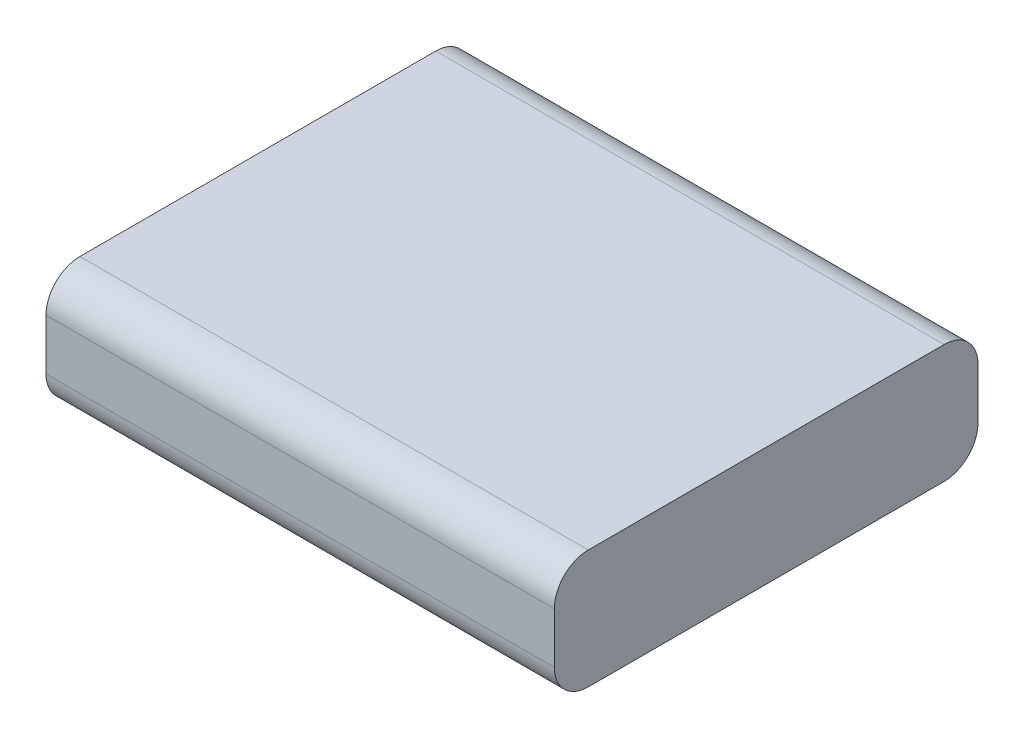
ISO-10303-21;
HEADER;
FILE_DESCRIPTION(('STEP AP214'),'2;1');
FILE_NAME('part.step','',(''),(''),'','','');
FILE_SCHEMA(('AUTOMOTIVE_DESIGN { 1 0 10303 214 1 1 1 1 }'));
ENDSEC;
DATA;
#1=APPLICATION_CONTEXT('core data for automotive mechanical design processes');
#2=APPLICATION_PROTOCOL_DEFINITION('international standard','automotive_design',2000,#1);
#3=PRODUCT_CONTEXT('',#1,'mechanical');
#4=PRODUCT('Part','Part','',(#3));
#5=PRODUCT_RELATED_PRODUCT_CATEGORY('part','',(#4));
#6=PRODUCT_DEFINITION_FORMATION('','',#4);
#7=PRODUCT_DEFINITION_CONTEXT('part definition',#1,'design');
#8=PRODUCT_DEFINITION('design','',#6,#7);
#9=PRODUCT_DEFINITION_SHAPE('','',#8);
#10=(LENGTH_UNIT() NAMED_UNIT(*) SI_UNIT(.MILLI.,.METRE.));
#11=(NAMED_UNIT(*) PLANE_ANGLE_UNIT() SI_UNIT($,.RADIAN.));
#12=(NAMED_UNIT(*) SI_UNIT($,.STERADIAN.) SOLID_ANGLE_UNIT());
#13=UNCERTAINTY_MEASURE_WITH_UNIT(LENGTH_MEASURE(1.E-05),#10,'distance_accuracy_value','');
#14=(GEOMETRIC_REPRESENTATION_CONTEXT(3) GLOBAL_UNCERTAINTY_ASSIGNED_CONTEXT((#13)) GLOBAL_UNIT_ASSIGNED_CONTEXT((#10,
#11,#12)) REPRESENTATION_CONTEXT('',''));
#15=CARTESIAN_POINT('',(0.,0.,0.));
#16=DIRECTION('',(0.,0.,1.));
#17=DIRECTION('',(1.,0.,0.));
#18=AXIS2_PLACEMENT_3D('',#15,#16,#17);
#19=CARTESIAN_POINT('',(15.,7.,-12.5));
#20=DIRECTION('',(-1.,0.,0.));
#21=DIRECTION('',(0.,0.,1.));
#22=AXIS2_PLACEMENT_3D('',#19,#20,#21);
#23=PLANE('',#22);
#24=DIRECTION('',(0.,0.,-1.));
#25=VECTOR('',#24,1.);
#26=CARTESIAN_POINT('',(15.,0.,-12.5));
#27=LINE('',#26,#25);
#28=CARTESIAN_POINT('',(15.,0.,10.5));
#29=VERTEX_POINT('',#28);
#30=CARTESIAN_POINT('',(15.,0.,-10.5));
#31=VERTEX_POINT('',#30);
#32=EDGE_CURVE('E160',#29,#31,#27,.T.);
#33=ORIENTED_EDGE('',*,*,#32,.T.);
#34=CARTESIAN_POINT('',(15.,2.,-10.5));
#35=DIRECTION('',(-1.,0.,0.));
#36=DIRECTION('',(0.,0.,1.));
#37=AXIS2_PLACEMENT_3D('',#34,#35,#36);
#38=CIRCLE('',#37,2.);
#39=CARTESIAN_POINT('',(15.,2.,-12.5));
#40=VERTEX_POINT('',#39);
#41=EDGE_CURVE('E141',#31,#40,#38,.F.);
#42=ORIENTED_EDGE('',*,*,#41,.T.);
#43=DIRECTION('',(0.,-1.,0.));
#44=VECTOR('',#43,1.);
#45=CARTESIAN_POINT('',(15.,7.,-12.5));
#46=LINE('',#45,#44);
#47=CARTESIAN_POINT('',(15.,5.,-12.5));
#48=VERTEX_POINT('',#47);
#49=EDGE_CURVE('E120',#48,#40,#46,.T.);
#50=ORIENTED_EDGE('',*,*,#49,.F.);
#51=CARTESIAN_POINT('',(15.,5.,-10.5));
#52=DIRECTION('',(-1.,0.,0.));
#53=DIRECTION('',(0.,0.,1.));
#54=AXIS2_PLACEMENT_3D('',#51,#52,#53);
#55=CIRCLE('',#54,2.);
#56=CARTESIAN_POINT('',(15.,7.,-10.5));
#57=VERTEX_POINT('',#56);
#58=EDGE_CURVE('E125',#48,#57,#55,.F.);
#59=ORIENTED_EDGE('',*,*,#58,.T.);
#60=DIRECTION('',(0.,0.,-1.));
#61=VECTOR('',#60,1.);
#62=CARTESIAN_POINT('',(15.,7.,-12.5));
#63=LINE('',#62,#61);
#64=CARTESIAN_POINT('',(15.,7.,10.5));
#65=VERTEX_POINT('',#64);
#66=EDGE_CURVE('E151',#65,#57,#63,.T.);
#67=ORIENTED_EDGE('',*,*,#66,.F.);
#68=CARTESIAN_POINT('',(15.,5.,10.5));
#69=DIRECTION('',(-1.,0.,0.));
#70=DIRECTION('',(0.,0.,1.));
#71=AXIS2_PLACEMENT_3D('',#68,#69,#70);
#72=CIRCLE('',#71,2.);
#73=CARTESIAN_POINT('',(15.,5.,12.5));
#74=VERTEX_POINT('',#73);
#75=EDGE_CURVE('E56',#65,#74,#72,.F.);
#76=ORIENTED_EDGE('',*,*,#75,.T.);
#77=DIRECTION('',(0.,-1.,0.));
#78=VECTOR('',#77,1.);
#79=CARTESIAN_POINT('',(15.,7.,12.5));
#80=LINE('',#79,#78);
#81=CARTESIAN_POINT('',(15.,2.,12.5));
#82=VERTEX_POINT('',#81);
#83=EDGE_CURVE('E157',#74,#82,#80,.T.);
#84=ORIENTED_EDGE('',*,*,#83,.T.);
#85=CARTESIAN_POINT('',(15.,2.,10.5));
#86=DIRECTION('',(-1.,0.,0.));
#87=DIRECTION('',(0.,0.,1.));
#88=AXIS2_PLACEMENT_3D('',#85,#86,#87);
#89=CIRCLE('',#88,2.);
#90=EDGE_CURVE('E48',#82,#29,#89,.F.);
#91=ORIENTED_EDGE('',*,*,#90,.T.);
#92=EDGE_LOOP('',(#33,#42,#50,#59,#67,#76,#84,#91));
#93=FACE_BOUND('',#92,.T.);
#94=ADVANCED_FACE('F33',(#93),#23,.F.);
#95=CARTESIAN_POINT('',(-15.,7.,-12.5));
#96=DIRECTION('',(0.,0.,1.));
#97=DIRECTION('',(1.,0.,0.));
#98=AXIS2_PLACEMENT_3D('',#95,#96,#97);
#99=PLANE('',#98);
#100=ORIENTED_EDGE('',*,*,#49,.T.);
#101=DIRECTION('',(-1.,0.,0.));
#102=VECTOR('',#101,1.);
#103=CARTESIAN_POINT('',(-15.,2.,-12.5));
#104=LINE('',#103,#102);
#105=CARTESIAN_POINT('',(-15.,2.,-12.5));
#106=VERTEX_POINT('',#105);
#107=EDGE_CURVE('E119',#40,#106,#104,.T.);
#108=ORIENTED_EDGE('',*,*,#107,.T.);
#109=DIRECTION('',(0.,-1.,0.));
#110=VECTOR('',#109,1.);
#111=CARTESIAN_POINT('',(-15.,7.,-12.5));
#112=LINE('',#111,#110);
#113=CARTESIAN_POINT('',(-15.,5.,-12.5));
#114=VERTEX_POINT('',#113);
#115=EDGE_CURVE('E103',#114,#106,#112,.T.);
#116=ORIENTED_EDGE('',*,*,#115,.F.);
#117=DIRECTION('',(-1.,0.,0.));
#118=VECTOR('',#117,1.);
#119=CARTESIAN_POINT('',(15.,5.,-12.5));
#120=LINE('',#119,#118);
#121=EDGE_CURVE('E116',#114,#48,#120,.F.);
#122=ORIENTED_EDGE('',*,*,#121,.T.);
#123=EDGE_LOOP('',(#100,#108,#116,#122));
#124=FACE_BOUND('',#123,.T.);
#125=ADVANCED_FACE('F115',(#124),#99,.F.);
#126=CARTESIAN_POINT('',(-15.,7.,-12.5));
#127=DIRECTION('',(1.,0.,0.));
#128=DIRECTION('',(0.,0.,-1.));
#129=AXIS2_PLACEMENT_3D('',#126,#127,#128);
#130=PLANE('',#129);
#131=ORIENTED_EDGE('',*,*,#115,.T.);
#132=CARTESIAN_POINT('',(-15.,2.,-10.5));
#133=DIRECTION('',(1.,0.,0.));
#134=DIRECTION('',(0.,0.,-1.));
#135=AXIS2_PLACEMENT_3D('',#132,#133,#134);
#136=CIRCLE('',#135,2.);
#137=CARTESIAN_POINT('',(-15.,0.,-10.5));
#138=VERTEX_POINT('',#137);
#139=EDGE_CURVE('E132',#106,#138,#136,.F.);
#140=ORIENTED_EDGE('',*,*,#139,.T.);
#141=DIRECTION('',(0.,0.,1.));
#142=VECTOR('',#141,1.);
#143=CARTESIAN_POINT('',(-15.,0.,-12.5));
#144=LINE('',#143,#142);
#145=CARTESIAN_POINT('',(-15.,0.,10.5));
#146=VERTEX_POINT('',#145);
#147=EDGE_CURVE('E155',#138,#146,#144,.T.);
#148=ORIENTED_EDGE('',*,*,#147,.T.);
#149=CARTESIAN_POINT('',(-15.,2.,10.5));
#150=DIRECTION('',(1.,0.,0.));
#151=DIRECTION('',(0.,0.,-1.));
#152=AXIS2_PLACEMENT_3D('',#149,#150,#151);
#153=CIRCLE('',#152,2.);
#154=CARTESIAN_POINT('',(-15.,2.,12.5));
#155=VERTEX_POINT('',#154);
#156=EDGE_CURVE('E109',#146,#155,#153,.F.);
#157=ORIENTED_EDGE('',*,*,#156,.T.);
#158=DIRECTION('',(0.,-1.,0.));
#159=VECTOR('',#158,1.);
#160=CARTESIAN_POINT('',(-15.,7.,12.5));
#161=LINE('',#160,#159);
#162=CARTESIAN_POINT('',(-15.,5.,12.5));
#163=VERTEX_POINT('',#162);
#164=EDGE_CURVE('E121',#163,#155,#161,.T.);
#165=ORIENTED_EDGE('',*,*,#164,.F.);
#166=CARTESIAN_POINT('',(-15.,5.,10.5));
#167=DIRECTION('',(1.,0.,0.));
#168=DIRECTION('',(0.,0.,-1.));
#169=AXIS2_PLACEMENT_3D('',#166,#167,#168);
#170=CIRCLE('',#169,2.);
#171=CARTESIAN_POINT('',(-15.,7.,10.5));
#172=VERTEX_POINT('',#171);
#173=EDGE_CURVE('E110',#163,#172,#170,.F.);
#174=ORIENTED_EDGE('',*,*,#173,.T.);
#175=DIRECTION('',(0.,0.,1.));
#176=VECTOR('',#175,1.);
#177=CARTESIAN_POINT('',(-15.,7.,-12.5));
#178=LINE('',#177,#176);
#179=CARTESIAN_POINT('',(-15.,7.,-10.5));
#180=VERTEX_POINT('',#179);
#181=EDGE_CURVE('E105',#180,#172,#178,.T.);
#182=ORIENTED_EDGE('',*,*,#181,.F.);
#183=CARTESIAN_POINT('',(-15.,5.,-10.5));
#184=DIRECTION('',(1.,0.,0.));
#185=DIRECTION('',(0.,0.,-1.));
#186=AXIS2_PLACEMENT_3D('',#183,#184,#185);
#187=CIRCLE('',#186,2.);
#188=EDGE_CURVE('E100',#180,#114,#187,.F.);
#189=ORIENTED_EDGE('',*,*,#188,.T.);
#190=EDGE_LOOP('',(#131,#140,#148,#157,#165,#174,#182,#189));
#191=FACE_BOUND('',#190,.T.);
#192=ADVANCED_FACE('F102',(#191),#130,.F.);
#193=CARTESIAN_POINT('',(-15.,7.,12.5));
#194=DIRECTION('',(0.,0.,-1.));
#195=DIRECTION('',(-1.,0.,0.));
#196=AXIS2_PLACEMENT_3D('',#193,#194,#195);
#197=PLANE('',#196);
#198=ORIENTED_EDGE('',*,*,#164,.T.);
#199=DIRECTION('',(1.,0.,0.));
#200=VECTOR('',#199,1.);
#201=CARTESIAN_POINT('',(-15.,2.,12.5));
#202=LINE('',#201,#200);
#203=EDGE_CURVE('E145',#155,#82,#202,.T.);
#204=ORIENTED_EDGE('',*,*,#203,.T.);
#205=ORIENTED_EDGE('',*,*,#83,.F.);
#206=DIRECTION('',(1.,0.,0.));
#207=VECTOR('',#206,1.);
#208=CARTESIAN_POINT('',(-15.,5.,12.5));
#209=LINE('',#208,#207);
#210=EDGE_CURVE('E143',#74,#163,#209,.F.);
#211=ORIENTED_EDGE('',*,*,#210,.T.);
#212=EDGE_LOOP('',(#198,#204,#205,#211));
#213=FACE_BOUND('',#212,.T.);
#214=ADVANCED_FACE('F168',(#213),#197,.F.);
#215=CARTESIAN_POINT('',(0.,7.,0.));
#216=DIRECTION('',(0.,1.,0.));
#217=DIRECTION('',(0.,0.,1.));
#218=AXIS2_PLACEMENT_3D('',#215,#216,#217);
#219=PLANE('',#218);
#220=ORIENTED_EDGE('',*,*,#66,.T.);
#221=DIRECTION('',(-1.,0.,0.));
#222=VECTOR('',#221,1.);
#223=CARTESIAN_POINT('',(-15.,7.,-10.5));
#224=LINE('',#223,#222);
#225=EDGE_CURVE('E11',#57,#180,#224,.T.);
#226=ORIENTED_EDGE('',*,*,#225,.T.);
#227=ORIENTED_EDGE('',*,*,#181,.T.);
#228=DIRECTION('',(1.,0.,0.));
#229=VECTOR('',#228,1.);
#230=CARTESIAN_POINT('',(15.,7.,10.5));
#231=LINE('',#230,#229);
#232=EDGE_CURVE('E41',#172,#65,#231,.T.);
#233=ORIENTED_EDGE('',*,*,#232,.T.);
#234=EDGE_LOOP('',(#220,#226,#227,#233));
#235=FACE_BOUND('',#234,.T.);
#236=ADVANCED_FACE('F150',(#235),#219,.T.);
#237=CARTESIAN_POINT('',(0.,0.,0.));
#238=DIRECTION('',(0.,1.,0.));
#239=DIRECTION('',(0.,0.,1.));
#240=AXIS2_PLACEMENT_3D('',#237,#238,#239);
#241=PLANE('',#240);
#242=ORIENTED_EDGE('',*,*,#147,.F.);
#243=DIRECTION('',(-1.,0.,0.));
#244=VECTOR('',#243,1.);
#245=CARTESIAN_POINT('',(0.,0.,-10.5));
#246=LINE('',#245,#244);
#247=EDGE_CURVE('E136',#138,#31,#246,.F.);
#248=ORIENTED_EDGE('',*,*,#247,.T.);
#249=ORIENTED_EDGE('',*,*,#32,.F.);
#250=DIRECTION('',(1.,0.,0.));
#251=VECTOR('',#250,1.);
#252=CARTESIAN_POINT('',(0.,0.,10.5));
#253=LINE('',#252,#251);
#254=EDGE_CURVE('E134',#29,#146,#253,.F.);
#255=ORIENTED_EDGE('',*,*,#254,.T.);
#256=EDGE_LOOP('',(#242,#248,#249,#255));
#257=FACE_BOUND('',#256,.T.);
#258=ADVANCED_FACE('F175',(#257),#241,.F.);
#259=CARTESIAN_POINT('',(-15.,2.,-10.5));
#260=DIRECTION('',(-1.,0.,0.));
#261=DIRECTION('',(0.,0.,1.));
#262=AXIS2_PLACEMENT_3D('',#259,#260,#261);
#263=CYLINDRICAL_SURFACE('',#262,2.);
#264=ORIENTED_EDGE('',*,*,#41,.F.);
#265=ORIENTED_EDGE('',*,*,#247,.F.);
#266=ORIENTED_EDGE('',*,*,#139,.F.);
#267=ORIENTED_EDGE('',*,*,#107,.F.);
#268=EDGE_LOOP('',(#264,#265,#266,#267));
#269=FACE_BOUND('',#268,.T.);
#270=ADVANCED_FACE('F179',(#269),#263,.T.);
#271=CARTESIAN_POINT('',(-15.,2.,10.5));
#272=DIRECTION('',(1.,0.,0.));
#273=DIRECTION('',(0.,0.,-1.));
#274=AXIS2_PLACEMENT_3D('',#271,#272,#273);
#275=CYLINDRICAL_SURFACE('',#274,2.);
#276=ORIENTED_EDGE('',*,*,#156,.F.);
#277=ORIENTED_EDGE('',*,*,#254,.F.);
#278=ORIENTED_EDGE('',*,*,#90,.F.);
#279=ORIENTED_EDGE('',*,*,#203,.F.);
#280=EDGE_LOOP('',(#276,#277,#278,#279));
#281=FACE_BOUND('',#280,.T.);
#282=ADVANCED_FACE('F171',(#281),#275,.T.);
#283=CARTESIAN_POINT('',(0.,5.,-10.5));
#284=DIRECTION('',(1.,0.,0.));
#285=DIRECTION('',(0.,0.,-1.));
#286=AXIS2_PLACEMENT_3D('',#283,#284,#285);
#287=CYLINDRICAL_SURFACE('',#286,2.);
#288=ORIENTED_EDGE('',*,*,#58,.F.);
#289=ORIENTED_EDGE('',*,*,#121,.F.);
#290=ORIENTED_EDGE('',*,*,#188,.F.);
#291=ORIENTED_EDGE('',*,*,#225,.F.);
#292=EDGE_LOOP('',(#288,#289,#290,#291));
#293=FACE_BOUND('',#292,.T.);
#294=ADVANCED_FACE('F124',(#293),#287,.T.);
#295=CARTESIAN_POINT('',(0.,5.,10.5));
#296=DIRECTION('',(-1.,0.,0.));
#297=DIRECTION('',(0.,0.,1.));
#298=AXIS2_PLACEMENT_3D('',#295,#296,#297);
#299=CYLINDRICAL_SURFACE('',#298,2.);
#300=ORIENTED_EDGE('',*,*,#173,.F.);
#301=ORIENTED_EDGE('',*,*,#210,.F.);
#302=ORIENTED_EDGE('',*,*,#75,.F.);
#303=ORIENTED_EDGE('',*,*,#232,.F.);
#304=EDGE_LOOP('',(#300,#301,#302,#303));
#305=FACE_BOUND('',#304,.T.);
#306=ADVANCED_FACE('F35',(#305),#299,.T.);
#307=CLOSED_SHELL('',(#94,#125,#192,#214,#236,#258,#270,#282,#294,#306));
#308=MANIFOLD_SOLID_BREP('B2',#307);
#309=ADVANCED_BREP_SHAPE_REPRESENTATION('',(#18,#308),#14);
#310=SHAPE_DEFINITION_REPRESENTATION(#9,#309);
ENDSEC;
END-ISO-10303-21;
